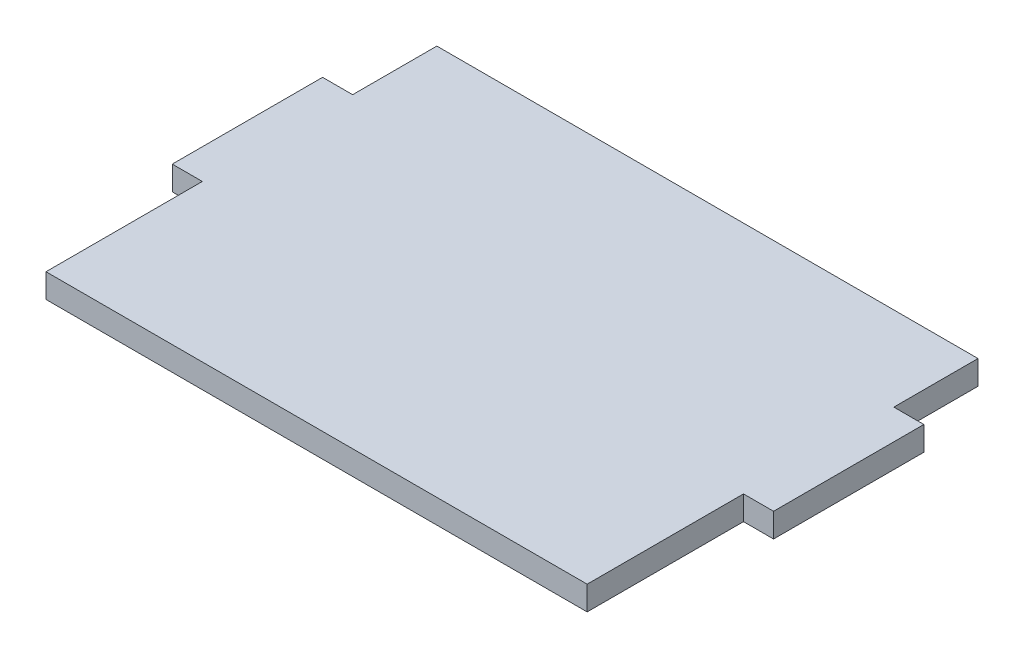
ISO-10303-21;
HEADER;
FILE_DESCRIPTION(('STEP AP214'),'2;1');
FILE_NAME('part.step','',(''),(''),'','','');
FILE_SCHEMA(('AUTOMOTIVE_DESIGN { 1 0 10303 214 1 1 1 1 }'));
ENDSEC;
DATA;
#1=APPLICATION_CONTEXT('core data for automotive mechanical design processes');
#2=APPLICATION_PROTOCOL_DEFINITION('international standard','automotive_design',2000,#1);
#3=PRODUCT_CONTEXT('',#1,'mechanical');
#4=PRODUCT('Part','Part','',(#3));
#5=PRODUCT_RELATED_PRODUCT_CATEGORY('part','',(#4));
#6=PRODUCT_DEFINITION_FORMATION('','',#4);
#7=PRODUCT_DEFINITION_CONTEXT('part definition',#1,'design');
#8=PRODUCT_DEFINITION('design','',#6,#7);
#9=PRODUCT_DEFINITION_SHAPE('','',#8);
#10=(LENGTH_UNIT() NAMED_UNIT(*) SI_UNIT(.MILLI.,.METRE.));
#11=(NAMED_UNIT(*) PLANE_ANGLE_UNIT() SI_UNIT($,.RADIAN.));
#12=(NAMED_UNIT(*) SI_UNIT($,.STERADIAN.) SOLID_ANGLE_UNIT());
#13=UNCERTAINTY_MEASURE_WITH_UNIT(LENGTH_MEASURE(1.E-05),#10,'distance_accuracy_value','');
#14=(GEOMETRIC_REPRESENTATION_CONTEXT(3) GLOBAL_UNCERTAINTY_ASSIGNED_CONTEXT((#13)) GLOBAL_UNIT_ASSIGNED_CONTEXT((#10,
#11,#12)) REPRESENTATION_CONTEXT('',''));
#15=CARTESIAN_POINT('',(0.,0.,0.));
#16=DIRECTION('',(0.,0.,1.));
#17=DIRECTION('',(1.,0.,0.));
#18=AXIS2_PLACEMENT_3D('',#15,#16,#17);
#19=CARTESIAN_POINT('',(-45.,4.,-32.5));
#20=DIRECTION('',(1.,0.,0.));
#21=DIRECTION('',(0.,0.,-1.));
#22=AXIS2_PLACEMENT_3D('',#19,#20,#21);
#23=PLANE('',#22);
#24=DIRECTION('',(0.,0.,1.));
#25=VECTOR('',#24,1.);
#26=CARTESIAN_POINT('',(-45.,0.,-32.5));
#27=LINE('',#26,#25);
#28=CARTESIAN_POINT('',(-45.,0.,-32.5));
#29=VERTEX_POINT('',#28);
#30=CARTESIAN_POINT('',(-45.,0.,-18.5));
#31=VERTEX_POINT('',#30);
#32=EDGE_CURVE('E157',#29,#31,#27,.T.);
#33=ORIENTED_EDGE('',*,*,#32,.T.);
#34=DIRECTION('',(0.,-1.,0.));
#35=VECTOR('',#34,1.);
#36=CARTESIAN_POINT('',(-45.,4.,-18.5));
#37=LINE('',#36,#35);
#38=CARTESIAN_POINT('',(-45.,4.,-18.5));
#39=VERTEX_POINT('',#38);
#40=EDGE_CURVE('E11',#39,#31,#37,.T.);
#41=ORIENTED_EDGE('',*,*,#40,.F.);
#42=DIRECTION('',(0.,0.,1.));
#43=VECTOR('',#42,1.);
#44=CARTESIAN_POINT('',(-45.,4.,-32.5));
#45=LINE('',#44,#43);
#46=CARTESIAN_POINT('',(-45.,4.,-32.5));
#47=VERTEX_POINT('',#46);
#48=EDGE_CURVE('E179',#47,#39,#45,.T.);
#49=ORIENTED_EDGE('',*,*,#48,.F.);
#50=DIRECTION('',(0.,-1.,0.));
#51=VECTOR('',#50,1.);
#52=CARTESIAN_POINT('',(-45.,4.,-32.5));
#53=LINE('',#52,#51);
#54=EDGE_CURVE('E153',#47,#29,#53,.T.);
#55=ORIENTED_EDGE('',*,*,#54,.T.);
#56=EDGE_LOOP('',(#33,#41,#49,#55));
#57=FACE_BOUND('',#56,.T.);
#58=ADVANCED_FACE('F37',(#57),#23,.F.);
#59=CARTESIAN_POINT('',(-50.,4.,-18.5));
#60=DIRECTION('',(0.,0.,1.));
#61=DIRECTION('',(1.,0.,0.));
#62=AXIS2_PLACEMENT_3D('',#59,#60,#61);
#63=PLANE('',#62);
#64=DIRECTION('',(-1.,0.,0.));
#65=VECTOR('',#64,1.);
#66=CARTESIAN_POINT('',(-50.,0.,-18.5));
#67=LINE('',#66,#65);
#68=CARTESIAN_POINT('',(-50.,0.,-18.5));
#69=VERTEX_POINT('',#68);
#70=EDGE_CURVE('E160',#31,#69,#67,.T.);
#71=ORIENTED_EDGE('',*,*,#70,.T.);
#72=DIRECTION('',(0.,-1.,0.));
#73=VECTOR('',#72,1.);
#74=CARTESIAN_POINT('',(-50.,4.,-18.5));
#75=LINE('',#74,#73);
#76=CARTESIAN_POINT('',(-50.,4.,-18.5));
#77=VERTEX_POINT('',#76);
#78=EDGE_CURVE('E45',#77,#69,#75,.T.);
#79=ORIENTED_EDGE('',*,*,#78,.F.);
#80=DIRECTION('',(-1.,0.,0.));
#81=VECTOR('',#80,1.);
#82=CARTESIAN_POINT('',(-50.,4.,-18.5));
#83=LINE('',#82,#81);
#84=EDGE_CURVE('E108',#39,#77,#83,.T.);
#85=ORIENTED_EDGE('',*,*,#84,.F.);
#86=ORIENTED_EDGE('',*,*,#40,.T.);
#87=EDGE_LOOP('',(#71,#79,#85,#86));
#88=FACE_BOUND('',#87,.T.);
#89=ADVANCED_FACE('F257',(#88),#63,.F.);
#90=CARTESIAN_POINT('',(-50.,4.,6.50000000000001));
#91=DIRECTION('',(1.,0.,0.));
#92=DIRECTION('',(0.,0.,-1.));
#93=AXIS2_PLACEMENT_3D('',#90,#91,#92);
#94=PLANE('',#93);
#95=DIRECTION('',(0.,0.,1.));
#96=VECTOR('',#95,1.);
#97=CARTESIAN_POINT('',(-50.,0.,6.50000000000001));
#98=LINE('',#97,#96);
#99=CARTESIAN_POINT('',(-50.,0.,6.50000000000001));
#100=VERTEX_POINT('',#99);
#101=EDGE_CURVE('E162',#69,#100,#98,.T.);
#102=ORIENTED_EDGE('',*,*,#101,.T.);
#103=DIRECTION('',(0.,-1.,0.));
#104=VECTOR('',#103,1.);
#105=CARTESIAN_POINT('',(-50.,4.,6.50000000000001));
#106=LINE('',#105,#104);
#107=CARTESIAN_POINT('',(-50.,4.,6.50000000000001));
#108=VERTEX_POINT('',#107);
#109=EDGE_CURVE('E198',#108,#100,#106,.T.);
#110=ORIENTED_EDGE('',*,*,#109,.F.);
#111=DIRECTION('',(0.,0.,1.));
#112=VECTOR('',#111,1.);
#113=CARTESIAN_POINT('',(-50.,4.,6.50000000000001));
#114=LINE('',#113,#112);
#115=EDGE_CURVE('E206',#77,#108,#114,.T.);
#116=ORIENTED_EDGE('',*,*,#115,.F.);
#117=ORIENTED_EDGE('',*,*,#78,.T.);
#118=EDGE_LOOP('',(#102,#110,#116,#117));
#119=FACE_BOUND('',#118,.T.);
#120=ADVANCED_FACE('F204',(#119),#94,.F.);
#121=CARTESIAN_POINT('',(-50.,4.,6.50000000000001));
#122=DIRECTION('',(0.,0.,-1.));
#123=DIRECTION('',(-1.,0.,0.));
#124=AXIS2_PLACEMENT_3D('',#121,#122,#123);
#125=PLANE('',#124);
#126=DIRECTION('',(1.,0.,0.));
#127=VECTOR('',#126,1.);
#128=CARTESIAN_POINT('',(-50.,0.,6.50000000000001));
#129=LINE('',#128,#127);
#130=CARTESIAN_POINT('',(-45.,0.,6.50000000000001));
#131=VERTEX_POINT('',#130);
#132=EDGE_CURVE('E164',#100,#131,#129,.T.);
#133=ORIENTED_EDGE('',*,*,#132,.T.);
#134=DIRECTION('',(0.,-1.,0.));
#135=VECTOR('',#134,1.);
#136=CARTESIAN_POINT('',(-45.,4.,6.50000000000001));
#137=LINE('',#136,#135);
#138=CARTESIAN_POINT('',(-45.,4.,6.50000000000001));
#139=VERTEX_POINT('',#138);
#140=EDGE_CURVE('E195',#139,#131,#137,.T.);
#141=ORIENTED_EDGE('',*,*,#140,.F.);
#142=DIRECTION('',(1.,0.,0.));
#143=VECTOR('',#142,1.);
#144=CARTESIAN_POINT('',(-50.,4.,6.50000000000001));
#145=LINE('',#144,#143);
#146=EDGE_CURVE('E224',#108,#139,#145,.T.);
#147=ORIENTED_EDGE('',*,*,#146,.F.);
#148=ORIENTED_EDGE('',*,*,#109,.T.);
#149=EDGE_LOOP('',(#133,#141,#147,#148));
#150=FACE_BOUND('',#149,.T.);
#151=ADVANCED_FACE('F215',(#150),#125,.F.);
#152=CARTESIAN_POINT('',(-45.,4.,32.5));
#153=DIRECTION('',(1.,0.,0.));
#154=DIRECTION('',(0.,0.,-1.));
#155=AXIS2_PLACEMENT_3D('',#152,#153,#154);
#156=PLANE('',#155);
#157=DIRECTION('',(0.,0.,1.));
#158=VECTOR('',#157,1.);
#159=CARTESIAN_POINT('',(-45.,0.,32.5));
#160=LINE('',#159,#158);
#161=CARTESIAN_POINT('',(-45.,0.,32.5));
#162=VERTEX_POINT('',#161);
#163=EDGE_CURVE('E166',#131,#162,#160,.T.);
#164=ORIENTED_EDGE('',*,*,#163,.T.);
#165=DIRECTION('',(0.,-1.,0.));
#166=VECTOR('',#165,1.);
#167=CARTESIAN_POINT('',(-45.,4.,32.5));
#168=LINE('',#167,#166);
#169=CARTESIAN_POINT('',(-45.,4.,32.5));
#170=VERTEX_POINT('',#169);
#171=EDGE_CURVE('E192',#170,#162,#168,.T.);
#172=ORIENTED_EDGE('',*,*,#171,.F.);
#173=DIRECTION('',(0.,0.,1.));
#174=VECTOR('',#173,1.);
#175=CARTESIAN_POINT('',(-45.,4.,32.5));
#176=LINE('',#175,#174);
#177=EDGE_CURVE('E221',#139,#170,#176,.T.);
#178=ORIENTED_EDGE('',*,*,#177,.F.);
#179=ORIENTED_EDGE('',*,*,#140,.T.);
#180=EDGE_LOOP('',(#164,#172,#178,#179));
#181=FACE_BOUND('',#180,.T.);
#182=ADVANCED_FACE('F219',(#181),#156,.F.);
#183=CARTESIAN_POINT('',(-45.,4.,32.5));
#184=DIRECTION('',(0.,0.,-1.));
#185=DIRECTION('',(-1.,0.,0.));
#186=AXIS2_PLACEMENT_3D('',#183,#184,#185);
#187=PLANE('',#186);
#188=DIRECTION('',(1.,0.,0.));
#189=VECTOR('',#188,1.);
#190=CARTESIAN_POINT('',(-45.,0.,32.5));
#191=LINE('',#190,#189);
#192=CARTESIAN_POINT('',(45.,0.,32.5));
#193=VERTEX_POINT('',#192);
#194=EDGE_CURVE('E168',#162,#193,#191,.T.);
#195=ORIENTED_EDGE('',*,*,#194,.T.);
#196=DIRECTION('',(0.,-1.,0.));
#197=VECTOR('',#196,1.);
#198=CARTESIAN_POINT('',(45.,4.,32.5));
#199=LINE('',#198,#197);
#200=CARTESIAN_POINT('',(45.,4.,32.5));
#201=VERTEX_POINT('',#200);
#202=EDGE_CURVE('E189',#201,#193,#199,.T.);
#203=ORIENTED_EDGE('',*,*,#202,.F.);
#204=DIRECTION('',(1.,0.,0.));
#205=VECTOR('',#204,1.);
#206=CARTESIAN_POINT('',(-45.,4.,32.5));
#207=LINE('',#206,#205);
#208=EDGE_CURVE('E223',#170,#201,#207,.T.);
#209=ORIENTED_EDGE('',*,*,#208,.F.);
#210=ORIENTED_EDGE('',*,*,#171,.T.);
#211=EDGE_LOOP('',(#195,#203,#209,#210));
#212=FACE_BOUND('',#211,.T.);
#213=ADVANCED_FACE('F270',(#212),#187,.F.);
#214=CARTESIAN_POINT('',(45.,4.,32.5));
#215=DIRECTION('',(-1.,0.,0.));
#216=DIRECTION('',(0.,0.,1.));
#217=AXIS2_PLACEMENT_3D('',#214,#215,#216);
#218=PLANE('',#217);
#219=DIRECTION('',(0.,0.,-1.));
#220=VECTOR('',#219,1.);
#221=CARTESIAN_POINT('',(45.,0.,32.5));
#222=LINE('',#221,#220);
#223=CARTESIAN_POINT('',(45.,0.,6.5));
#224=VERTEX_POINT('',#223);
#225=EDGE_CURVE('E170',#193,#224,#222,.T.);
#226=ORIENTED_EDGE('',*,*,#225,.T.);
#227=DIRECTION('',(0.,-1.,0.));
#228=VECTOR('',#227,1.);
#229=CARTESIAN_POINT('',(45.,4.,6.5));
#230=LINE('',#229,#228);
#231=CARTESIAN_POINT('',(45.,4.,6.5));
#232=VERTEX_POINT('',#231);
#233=EDGE_CURVE('E186',#232,#224,#230,.T.);
#234=ORIENTED_EDGE('',*,*,#233,.F.);
#235=DIRECTION('',(0.,0.,-1.));
#236=VECTOR('',#235,1.);
#237=CARTESIAN_POINT('',(45.,4.,32.5));
#238=LINE('',#237,#236);
#239=EDGE_CURVE('E226',#201,#232,#238,.T.);
#240=ORIENTED_EDGE('',*,*,#239,.F.);
#241=ORIENTED_EDGE('',*,*,#202,.T.);
#242=EDGE_LOOP('',(#226,#234,#240,#241));
#243=FACE_BOUND('',#242,.T.);
#244=ADVANCED_FACE('F273',(#243),#218,.F.);
#245=CARTESIAN_POINT('',(50.,4.,6.5));
#246=DIRECTION('',(0.,0.,-1.));
#247=DIRECTION('',(-1.,0.,0.));
#248=AXIS2_PLACEMENT_3D('',#245,#246,#247);
#249=PLANE('',#248);
#250=DIRECTION('',(1.,0.,0.));
#251=VECTOR('',#250,1.);
#252=CARTESIAN_POINT('',(50.,0.,6.5));
#253=LINE('',#252,#251);
#254=CARTESIAN_POINT('',(50.,0.,6.5));
#255=VERTEX_POINT('',#254);
#256=EDGE_CURVE('E172',#224,#255,#253,.T.);
#257=ORIENTED_EDGE('',*,*,#256,.T.);
#258=DIRECTION('',(0.,-1.,0.));
#259=VECTOR('',#258,1.);
#260=CARTESIAN_POINT('',(50.,4.,6.5));
#261=LINE('',#260,#259);
#262=CARTESIAN_POINT('',(50.,4.,6.5));
#263=VERTEX_POINT('',#262);
#264=EDGE_CURVE('E183',#263,#255,#261,.T.);
#265=ORIENTED_EDGE('',*,*,#264,.F.);
#266=DIRECTION('',(1.,0.,0.));
#267=VECTOR('',#266,1.);
#268=CARTESIAN_POINT('',(50.,4.,6.5));
#269=LINE('',#268,#267);
#270=EDGE_CURVE('E232',#232,#263,#269,.T.);
#271=ORIENTED_EDGE('',*,*,#270,.F.);
#272=ORIENTED_EDGE('',*,*,#233,.T.);
#273=EDGE_LOOP('',(#257,#265,#271,#272));
#274=FACE_BOUND('',#273,.T.);
#275=ADVANCED_FACE('F238',(#274),#249,.F.);
#276=CARTESIAN_POINT('',(50.,4.,6.5));
#277=DIRECTION('',(-1.,0.,0.));
#278=DIRECTION('',(0.,0.,1.));
#279=AXIS2_PLACEMENT_3D('',#276,#277,#278);
#280=PLANE('',#279);
#281=DIRECTION('',(0.,0.,-1.));
#282=VECTOR('',#281,1.);
#283=CARTESIAN_POINT('',(50.,0.,6.5));
#284=LINE('',#283,#282);
#285=CARTESIAN_POINT('',(50.,0.,-18.5));
#286=VERTEX_POINT('',#285);
#287=EDGE_CURVE('E174',#255,#286,#284,.T.);
#288=ORIENTED_EDGE('',*,*,#287,.T.);
#289=DIRECTION('',(0.,-1.,0.));
#290=VECTOR('',#289,1.);
#291=CARTESIAN_POINT('',(50.,4.,-18.5));
#292=LINE('',#291,#290);
#293=CARTESIAN_POINT('',(50.,4.,-18.5));
#294=VERTEX_POINT('',#293);
#295=EDGE_CURVE('E148',#294,#286,#292,.T.);
#296=ORIENTED_EDGE('',*,*,#295,.F.);
#297=DIRECTION('',(0.,0.,-1.));
#298=VECTOR('',#297,1.);
#299=CARTESIAN_POINT('',(50.,4.,6.5));
#300=LINE('',#299,#298);
#301=EDGE_CURVE('E139',#263,#294,#300,.T.);
#302=ORIENTED_EDGE('',*,*,#301,.F.);
#303=ORIENTED_EDGE('',*,*,#264,.T.);
#304=EDGE_LOOP('',(#288,#296,#302,#303));
#305=FACE_BOUND('',#304,.T.);
#306=ADVANCED_FACE('F242',(#305),#280,.F.);
#307=CARTESIAN_POINT('',(50.,4.,-18.5));
#308=DIRECTION('',(0.,0.,1.));
#309=DIRECTION('',(1.,0.,0.));
#310=AXIS2_PLACEMENT_3D('',#307,#308,#309);
#311=PLANE('',#310);
#312=DIRECTION('',(-1.,0.,0.));
#313=VECTOR('',#312,1.);
#314=CARTESIAN_POINT('',(50.,0.,-18.5));
#315=LINE('',#314,#313);
#316=CARTESIAN_POINT('',(45.,0.,-18.5));
#317=VERTEX_POINT('',#316);
#318=EDGE_CURVE('E147',#286,#317,#315,.T.);
#319=ORIENTED_EDGE('',*,*,#318,.T.);
#320=DIRECTION('',(0.,-1.,0.));
#321=VECTOR('',#320,1.);
#322=CARTESIAN_POINT('',(45.,4.,-18.5));
#323=LINE('',#322,#321);
#324=CARTESIAN_POINT('',(45.,4.,-18.5));
#325=VERTEX_POINT('',#324);
#326=EDGE_CURVE('E144',#325,#317,#323,.T.);
#327=ORIENTED_EDGE('',*,*,#326,.F.);
#328=DIRECTION('',(-1.,0.,0.));
#329=VECTOR('',#328,1.);
#330=CARTESIAN_POINT('',(50.,4.,-18.5));
#331=LINE('',#330,#329);
#332=EDGE_CURVE('E133',#294,#325,#331,.T.);
#333=ORIENTED_EDGE('',*,*,#332,.F.);
#334=ORIENTED_EDGE('',*,*,#295,.T.);
#335=EDGE_LOOP('',(#319,#327,#333,#334));
#336=FACE_BOUND('',#335,.T.);
#337=ADVANCED_FACE('F145',(#336),#311,.F.);
#338=CARTESIAN_POINT('',(45.,4.,-32.5));
#339=DIRECTION('',(-1.,0.,0.));
#340=DIRECTION('',(0.,0.,1.));
#341=AXIS2_PLACEMENT_3D('',#338,#339,#340);
#342=PLANE('',#341);
#343=DIRECTION('',(0.,0.,-1.));
#344=VECTOR('',#343,1.);
#345=CARTESIAN_POINT('',(45.,0.,-32.5));
#346=LINE('',#345,#344);
#347=CARTESIAN_POINT('',(45.,0.,-32.5));
#348=VERTEX_POINT('',#347);
#349=EDGE_CURVE('E94',#317,#348,#346,.T.);
#350=ORIENTED_EDGE('',*,*,#349,.T.);
#351=DIRECTION('',(0.,-1.,0.));
#352=VECTOR('',#351,1.);
#353=CARTESIAN_POINT('',(45.,4.,-32.5));
#354=LINE('',#353,#352);
#355=CARTESIAN_POINT('',(45.,4.,-32.5));
#356=VERTEX_POINT('',#355);
#357=EDGE_CURVE('E149',#356,#348,#354,.T.);
#358=ORIENTED_EDGE('',*,*,#357,.F.);
#359=DIRECTION('',(0.,0.,-1.));
#360=VECTOR('',#359,1.);
#361=CARTESIAN_POINT('',(45.,4.,-32.5));
#362=LINE('',#361,#360);
#363=EDGE_CURVE('E137',#325,#356,#362,.T.);
#364=ORIENTED_EDGE('',*,*,#363,.F.);
#365=ORIENTED_EDGE('',*,*,#326,.T.);
#366=EDGE_LOOP('',(#350,#358,#364,#365));
#367=FACE_BOUND('',#366,.T.);
#368=ADVANCED_FACE('F151',(#367),#342,.F.);
#369=CARTESIAN_POINT('',(-45.,4.,-32.5));
#370=DIRECTION('',(0.,0.,1.));
#371=DIRECTION('',(1.,0.,0.));
#372=AXIS2_PLACEMENT_3D('',#369,#370,#371);
#373=PLANE('',#372);
#374=DIRECTION('',(-1.,0.,0.));
#375=VECTOR('',#374,1.);
#376=CARTESIAN_POINT('',(-45.,0.,-32.5));
#377=LINE('',#376,#375);
#378=EDGE_CURVE('E100',#348,#29,#377,.T.);
#379=ORIENTED_EDGE('',*,*,#378,.T.);
#380=ORIENTED_EDGE('',*,*,#54,.F.);
#381=DIRECTION('',(-1.,0.,0.));
#382=VECTOR('',#381,1.);
#383=CARTESIAN_POINT('',(-45.,4.,-32.5));
#384=LINE('',#383,#382);
#385=EDGE_CURVE('E53',#356,#47,#384,.T.);
#386=ORIENTED_EDGE('',*,*,#385,.F.);
#387=ORIENTED_EDGE('',*,*,#357,.T.);
#388=EDGE_LOOP('',(#379,#380,#386,#387));
#389=FACE_BOUND('',#388,.T.);
#390=ADVANCED_FACE('F246',(#389),#373,.F.);
#391=CARTESIAN_POINT('',(0.,4.,0.));
#392=DIRECTION('',(0.,1.,0.));
#393=DIRECTION('',(0.,0.,1.));
#394=AXIS2_PLACEMENT_3D('',#391,#392,#393);
#395=PLANE('',#394);
#396=ORIENTED_EDGE('',*,*,#48,.T.);
#397=ORIENTED_EDGE('',*,*,#84,.T.);
#398=ORIENTED_EDGE('',*,*,#115,.T.);
#399=ORIENTED_EDGE('',*,*,#146,.T.);
#400=ORIENTED_EDGE('',*,*,#177,.T.);
#401=ORIENTED_EDGE('',*,*,#208,.T.);
#402=ORIENTED_EDGE('',*,*,#239,.T.);
#403=ORIENTED_EDGE('',*,*,#270,.T.);
#404=ORIENTED_EDGE('',*,*,#301,.T.);
#405=ORIENTED_EDGE('',*,*,#332,.T.);
#406=ORIENTED_EDGE('',*,*,#363,.T.);
#407=ORIENTED_EDGE('',*,*,#385,.T.);
#408=EDGE_LOOP('',(#396,#397,#398,#399,#400,#401,#402,#403,#404,#405,#406,#407));
#409=FACE_BOUND('',#408,.T.);
#410=ADVANCED_FACE('F135',(#409),#395,.T.);
#411=CARTESIAN_POINT('',(0.,0.,0.));
#412=DIRECTION('',(0.,1.,0.));
#413=DIRECTION('',(0.,0.,1.));
#414=AXIS2_PLACEMENT_3D('',#411,#412,#413);
#415=PLANE('',#414);
#416=ORIENTED_EDGE('',*,*,#32,.F.);
#417=ORIENTED_EDGE('',*,*,#378,.F.);
#418=ORIENTED_EDGE('',*,*,#349,.F.);
#419=ORIENTED_EDGE('',*,*,#318,.F.);
#420=ORIENTED_EDGE('',*,*,#287,.F.);
#421=ORIENTED_EDGE('',*,*,#256,.F.);
#422=ORIENTED_EDGE('',*,*,#225,.F.);
#423=ORIENTED_EDGE('',*,*,#194,.F.);
#424=ORIENTED_EDGE('',*,*,#163,.F.);
#425=ORIENTED_EDGE('',*,*,#132,.F.);
#426=ORIENTED_EDGE('',*,*,#101,.F.);
#427=ORIENTED_EDGE('',*,*,#70,.F.);
#428=EDGE_LOOP('',(#416,#417,#418,#419,#420,#421,#422,#423,#424,#425,#426,#427));
#429=FACE_BOUND('',#428,.T.);
#430=ADVANCED_FACE('F210',(#429),#415,.F.);
#431=CLOSED_SHELL('',(#58,#89,#120,#151,#182,#213,#244,#275,#306,#337,#368,#390,#410,#430));
#432=MANIFOLD_SOLID_BREP('B2',#431);
#433=ADVANCED_BREP_SHAPE_REPRESENTATION('',(#18,#432),#14);
#434=SHAPE_DEFINITION_REPRESENTATION(#9,#433);
ENDSEC;
END-ISO-10303-21;
